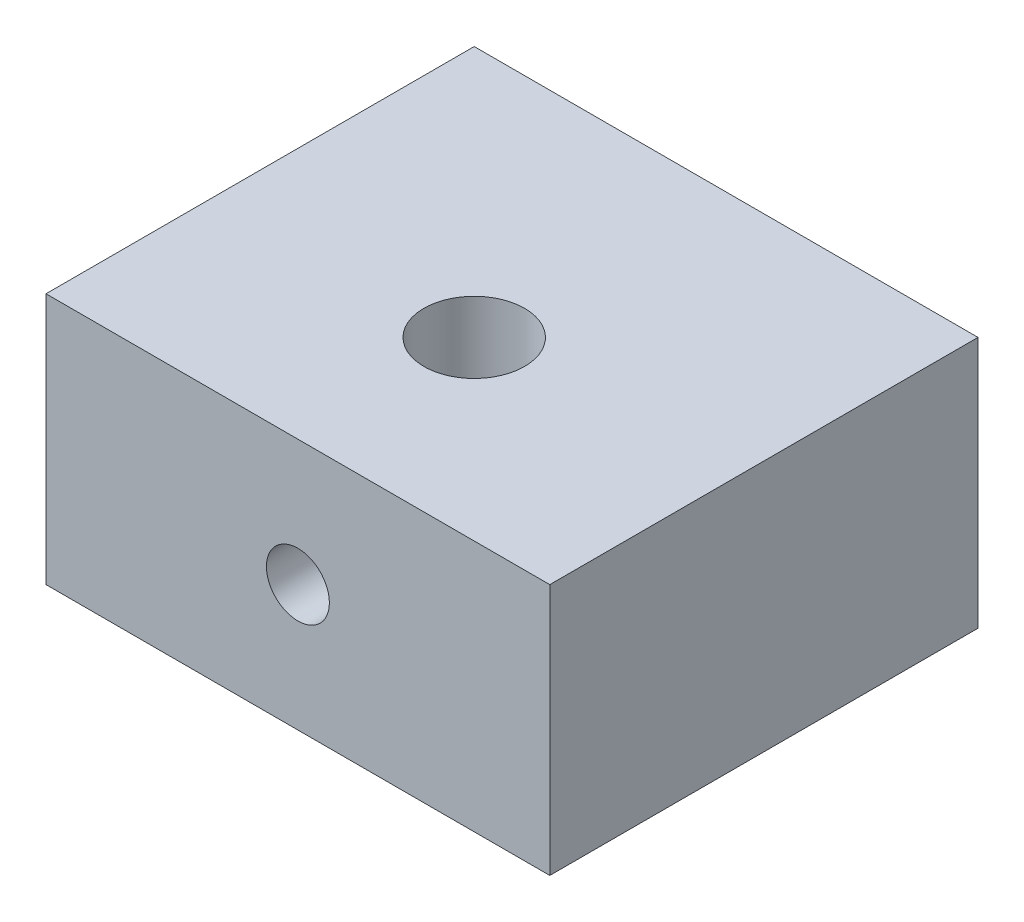
ISO-10303-21;
HEADER;
FILE_DESCRIPTION(('STEP AP214'),'2;1');
FILE_NAME('part.step','',(''),(''),'','','');
FILE_SCHEMA(('AUTOMOTIVE_DESIGN { 1 0 10303 214 1 1 1 1 }'));
ENDSEC;
DATA;
#1=APPLICATION_CONTEXT('core data for automotive mechanical design processes');
#2=APPLICATION_PROTOCOL_DEFINITION('international standard','automotive_design',2000,#1);
#3=PRODUCT_CONTEXT('',#1,'mechanical');
#4=PRODUCT('Part','Part','',(#3));
#5=PRODUCT_RELATED_PRODUCT_CATEGORY('part','',(#4));
#6=PRODUCT_DEFINITION_FORMATION('','',#4);
#7=PRODUCT_DEFINITION_CONTEXT('part definition',#1,'design');
#8=PRODUCT_DEFINITION('design','',#6,#7);
#9=PRODUCT_DEFINITION_SHAPE('','',#8);
#10=(LENGTH_UNIT() NAMED_UNIT(*) SI_UNIT(.MILLI.,.METRE.));
#11=(NAMED_UNIT(*) PLANE_ANGLE_UNIT() SI_UNIT($,.RADIAN.));
#12=(NAMED_UNIT(*) SI_UNIT($,.STERADIAN.) SOLID_ANGLE_UNIT());
#13=UNCERTAINTY_MEASURE_WITH_UNIT(LENGTH_MEASURE(1.E-05),#10,'distance_accuracy_value','');
#14=(GEOMETRIC_REPRESENTATION_CONTEXT(3) GLOBAL_UNCERTAINTY_ASSIGNED_CONTEXT((#13)) GLOBAL_UNIT_ASSIGNED_CONTEXT((#10,
#11,#12)) REPRESENTATION_CONTEXT('',''));
#15=CARTESIAN_POINT('',(0.,0.,0.));
#16=DIRECTION('',(0.,0.,1.));
#17=DIRECTION('',(1.,0.,0.));
#18=AXIS2_PLACEMENT_3D('',#15,#16,#17);
#19=CARTESIAN_POINT('',(0.,0.,17.));
#20=DIRECTION('',(1.,0.,0.));
#21=DIRECTION('',(0.,0.,-1.));
#22=AXIS2_PLACEMENT_3D('',#19,#20,#21);
#23=PLANE('',#22);
#24=DIRECTION('',(0.,-1.,0.));
#25=VECTOR('',#24,1.);
#26=CARTESIAN_POINT('',(0.,0.,0.));
#27=LINE('',#26,#25);
#28=CARTESIAN_POINT('',(0.,10.,0.));
#29=VERTEX_POINT('',#28);
#30=CARTESIAN_POINT('',(0.,0.,0.));
#31=VERTEX_POINT('',#30);
#32=EDGE_CURVE('E126',#29,#31,#27,.T.);
#33=ORIENTED_EDGE('',*,*,#32,.T.);
#34=DIRECTION('',(0.,0.,-1.));
#35=VECTOR('',#34,1.);
#36=CARTESIAN_POINT('',(0.,0.,17.));
#37=LINE('',#36,#35);
#38=CARTESIAN_POINT('',(0.,0.,17.));
#39=VERTEX_POINT('',#38);
#40=EDGE_CURVE('E11',#39,#31,#37,.T.);
#41=ORIENTED_EDGE('',*,*,#40,.F.);
#42=DIRECTION('',(0.,-1.,0.));
#43=VECTOR('',#42,1.);
#44=CARTESIAN_POINT('',(0.,0.,17.));
#45=LINE('',#44,#43);
#46=CARTESIAN_POINT('',(0.,10.,17.));
#47=VERTEX_POINT('',#46);
#48=EDGE_CURVE('E129',#47,#39,#45,.T.);
#49=ORIENTED_EDGE('',*,*,#48,.F.);
#50=DIRECTION('',(0.,0.,-1.));
#51=VECTOR('',#50,1.);
#52=CARTESIAN_POINT('',(0.,10.,17.));
#53=LINE('',#52,#51);
#54=EDGE_CURVE('E135',#47,#29,#53,.T.);
#55=ORIENTED_EDGE('',*,*,#54,.T.);
#56=EDGE_LOOP('',(#33,#41,#49,#55));
#57=FACE_BOUND('',#56,.T.);
#58=ADVANCED_FACE('F45',(#57),#23,.F.);
#59=CARTESIAN_POINT('',(0.,0.,17.));
#60=DIRECTION('',(0.,1.,0.));
#61=DIRECTION('',(0.,0.,1.));
#62=AXIS2_PLACEMENT_3D('',#59,#60,#61);
#63=PLANE('',#62);
#64=CARTESIAN_POINT('',(10.,0.,10.));
#65=DIRECTION('',(0.,-1.,0.));
#66=DIRECTION('',(0.,0.,-1.));
#67=AXIS2_PLACEMENT_3D('',#64,#65,#66);
#68=CIRCLE('',#67,2.);
#69=CARTESIAN_POINT('',(10.,0.,8.));
#70=VERTEX_POINT('',#69);
#71=EDGE_CURVE('E122',#70,#70,#68,.T.);
#72=ORIENTED_EDGE('',*,*,#71,.F.);
#73=EDGE_LOOP('',(#72));
#74=FACE_BOUND('',#73,.T.);
#75=DIRECTION('',(1.,0.,0.));
#76=VECTOR('',#75,1.);
#77=CARTESIAN_POINT('',(0.,0.,0.));
#78=LINE('',#77,#76);
#79=CARTESIAN_POINT('',(20.,0.,0.));
#80=VERTEX_POINT('',#79);
#81=EDGE_CURVE('E138',#31,#80,#78,.T.);
#82=ORIENTED_EDGE('',*,*,#81,.T.);
#83=DIRECTION('',(0.,0.,-1.));
#84=VECTOR('',#83,1.);
#85=CARTESIAN_POINT('',(20.,0.,17.));
#86=LINE('',#85,#84);
#87=CARTESIAN_POINT('',(20.,0.,17.));
#88=VERTEX_POINT('',#87);
#89=EDGE_CURVE('E53',#88,#80,#86,.T.);
#90=ORIENTED_EDGE('',*,*,#89,.F.);
#91=DIRECTION('',(1.,0.,0.));
#92=VECTOR('',#91,1.);
#93=CARTESIAN_POINT('',(0.,0.,17.));
#94=LINE('',#93,#92);
#95=EDGE_CURVE('E92',#39,#88,#94,.T.);
#96=ORIENTED_EDGE('',*,*,#95,.F.);
#97=ORIENTED_EDGE('',*,*,#40,.T.);
#98=EDGE_LOOP('',(#82,#90,#96,#97));
#99=FACE_BOUND('',#98,.T.);
#100=ADVANCED_FACE('F165',(#74,#99),#63,.F.);
#101=CARTESIAN_POINT('',(20.,0.,17.));
#102=DIRECTION('',(-1.,0.,0.));
#103=DIRECTION('',(0.,0.,1.));
#104=AXIS2_PLACEMENT_3D('',#101,#102,#103);
#105=PLANE('',#104);
#106=DIRECTION('',(0.,1.,0.));
#107=VECTOR('',#106,1.);
#108=CARTESIAN_POINT('',(20.,0.,0.));
#109=LINE('',#108,#107);
#110=CARTESIAN_POINT('',(20.,10.,0.));
#111=VERTEX_POINT('',#110);
#112=EDGE_CURVE('E79',#80,#111,#109,.T.);
#113=ORIENTED_EDGE('',*,*,#112,.T.);
#114=DIRECTION('',(0.,0.,-1.));
#115=VECTOR('',#114,1.);
#116=CARTESIAN_POINT('',(20.,10.,17.));
#117=LINE('',#116,#115);
#118=CARTESIAN_POINT('',(20.,10.,17.));
#119=VERTEX_POINT('',#118);
#120=EDGE_CURVE('E143',#119,#111,#117,.T.);
#121=ORIENTED_EDGE('',*,*,#120,.F.);
#122=DIRECTION('',(0.,1.,0.));
#123=VECTOR('',#122,1.);
#124=CARTESIAN_POINT('',(20.,0.,17.));
#125=LINE('',#124,#123);
#126=EDGE_CURVE('E132',#88,#119,#125,.T.);
#127=ORIENTED_EDGE('',*,*,#126,.F.);
#128=ORIENTED_EDGE('',*,*,#89,.T.);
#129=EDGE_LOOP('',(#113,#121,#127,#128));
#130=FACE_BOUND('',#129,.T.);
#131=ADVANCED_FACE('F145',(#130),#105,.F.);
#132=CARTESIAN_POINT('',(0.,10.,17.));
#133=DIRECTION('',(0.,-1.,0.));
#134=DIRECTION('',(0.,0.,-1.));
#135=AXIS2_PLACEMENT_3D('',#132,#133,#134);
#136=PLANE('',#135);
#137=CARTESIAN_POINT('',(10.,10.,10.));
#138=DIRECTION('',(0.,-1.,0.));
#139=DIRECTION('',(0.,0.,-1.));
#140=AXIS2_PLACEMENT_3D('',#137,#138,#139);
#141=CIRCLE('',#140,2.);
#142=CARTESIAN_POINT('',(10.,10.,8.));
#143=VERTEX_POINT('',#142);
#144=EDGE_CURVE('E123',#143,#143,#141,.T.);
#145=ORIENTED_EDGE('',*,*,#144,.T.);
#146=EDGE_LOOP('',(#145));
#147=FACE_BOUND('',#146,.T.);
#148=DIRECTION('',(-1.,0.,0.));
#149=VECTOR('',#148,1.);
#150=CARTESIAN_POINT('',(0.,10.,0.));
#151=LINE('',#150,#149);
#152=EDGE_CURVE('E85',#111,#29,#151,.T.);
#153=ORIENTED_EDGE('',*,*,#152,.T.);
#154=ORIENTED_EDGE('',*,*,#54,.F.);
#155=DIRECTION('',(-1.,0.,0.));
#156=VECTOR('',#155,1.);
#157=CARTESIAN_POINT('',(0.,10.,17.));
#158=LINE('',#157,#156);
#159=EDGE_CURVE('E61',#119,#47,#158,.T.);
#160=ORIENTED_EDGE('',*,*,#159,.F.);
#161=ORIENTED_EDGE('',*,*,#120,.T.);
#162=EDGE_LOOP('',(#153,#154,#160,#161));
#163=FACE_BOUND('',#162,.T.);
#164=ADVANCED_FACE('F152',(#147,#163),#136,.F.);
#165=CARTESIAN_POINT('',(0.,0.,17.));
#166=DIRECTION('',(0.,0.,-1.));
#167=DIRECTION('',(-1.,0.,0.));
#168=AXIS2_PLACEMENT_3D('',#165,#166,#167);
#169=PLANE('',#168);
#170=CARTESIAN_POINT('',(10.,5.,17.));
#171=DIRECTION('',(0.,0.,1.));
#172=DIRECTION('',(1.,0.,0.));
#173=AXIS2_PLACEMENT_3D('',#170,#171,#172);
#174=CIRCLE('',#173,1.24999999999999);
#175=CARTESIAN_POINT('',(11.25,5.,17.));
#176=VERTEX_POINT('',#175);
#177=EDGE_CURVE('E206',#176,#176,#174,.T.);
#178=ORIENTED_EDGE('',*,*,#177,.F.);
#179=EDGE_LOOP('',(#178));
#180=FACE_BOUND('',#179,.T.);
#181=ORIENTED_EDGE('',*,*,#48,.T.);
#182=ORIENTED_EDGE('',*,*,#95,.T.);
#183=ORIENTED_EDGE('',*,*,#126,.T.);
#184=ORIENTED_EDGE('',*,*,#159,.T.);
#185=EDGE_LOOP('',(#181,#182,#183,#184));
#186=FACE_BOUND('',#185,.T.);
#187=ADVANCED_FACE('F154',(#180,#186),#169,.F.);
#188=CARTESIAN_POINT('',(0.,0.,0.));
#189=DIRECTION('',(0.,0.,-1.));
#190=DIRECTION('',(-1.,0.,0.));
#191=AXIS2_PLACEMENT_3D('',#188,#189,#190);
#192=PLANE('',#191);
#193=CARTESIAN_POINT('',(15.,5.,0.));
#194=DIRECTION('',(0.,0.,-1.));
#195=DIRECTION('',(-1.,0.,0.));
#196=AXIS2_PLACEMENT_3D('',#193,#194,#195);
#197=CIRCLE('',#196,1.24999999999999);
#198=CARTESIAN_POINT('',(13.75,5.,0.));
#199=VERTEX_POINT('',#198);
#200=EDGE_CURVE('E110',#199,#199,#197,.T.);
#201=ORIENTED_EDGE('',*,*,#200,.F.);
#202=EDGE_LOOP('',(#201));
#203=FACE_BOUND('',#202,.T.);
#204=CARTESIAN_POINT('',(5.,5.,0.));
#205=DIRECTION('',(0.,0.,-1.));
#206=DIRECTION('',(-1.,0.,0.));
#207=AXIS2_PLACEMENT_3D('',#204,#205,#206);
#208=CIRCLE('',#207,1.24999999999999);
#209=CARTESIAN_POINT('',(3.75000000000001,5.,0.));
#210=VERTEX_POINT('',#209);
#211=EDGE_CURVE('E109',#210,#210,#208,.T.);
#212=ORIENTED_EDGE('',*,*,#211,.F.);
#213=EDGE_LOOP('',(#212));
#214=FACE_BOUND('',#213,.T.);
#215=ORIENTED_EDGE('',*,*,#32,.F.);
#216=ORIENTED_EDGE('',*,*,#152,.F.);
#217=ORIENTED_EDGE('',*,*,#112,.F.);
#218=ORIENTED_EDGE('',*,*,#81,.F.);
#219=EDGE_LOOP('',(#215,#216,#217,#218));
#220=FACE_BOUND('',#219,.T.);
#221=ADVANCED_FACE('F148',(#203,#214,#220),#192,.T.);
#222=CARTESIAN_POINT('',(10.,10.,10.));
#223=DIRECTION('',(0.,-1.,0.));
#224=DIRECTION('',(0.,0.,-1.));
#225=AXIS2_PLACEMENT_3D('',#222,#223,#224);
#226=CYLINDRICAL_SURFACE('',#225,2.);
#227=CARTESIAN_POINT('',(11.25,5.,11.5612494995996));
#228=CARTESIAN_POINT('',(11.2499946221048,5.06212028180293,11.5612580007256));
#229=CARTESIAN_POINT('',(11.2453269384966,5.12433783537026,11.5650264270884));
#230=CARTESIAN_POINT('',(11.2269895083293,5.24667632007938,11.5794371720548));
#231=CARTESIAN_POINT('',(11.2132953043055,5.30679108636524,11.5900981646412));
#232=CARTESIAN_POINT('',(11.1778807391187,5.42278232269884,11.6165008532904));
#233=CARTESIAN_POINT('',(11.1562299333278,5.47869060868181,11.6321983741803));
#234=CARTESIAN_POINT('',(11.1057194556192,5.58600886163815,11.6668295071443));
#235=CARTESIAN_POINT('',(11.0768595870609,5.6374187058565,11.6857632074868));
#236=CARTESIAN_POINT('',(11.0082393792836,5.74186515447698,11.7277961137471));
#237=CARTESIAN_POINT('',(10.9675360936925,5.79419474083259,11.7511133822735));
#238=CARTESIAN_POINT('',(10.8783086644969,5.89188269914496,11.7975282085488));
#239=CARTESIAN_POINT('',(10.8297777812974,5.93723499728392,11.8206255586333));
#240=CARTESIAN_POINT('',(10.7191866652585,6.02510358514812,11.8672945389101));
#241=CARTESIAN_POINT('',(10.6562005689106,6.0666176681043,11.8905872224145));
#242=CARTESIAN_POINT('',(10.5224040708373,6.13812520476315,11.9318323169914));
#243=CARTESIAN_POINT('',(10.4516015064782,6.16813006575125,11.9497900117984));
#244=CARTESIAN_POINT('',(10.311776878362,6.21248231060706,11.976698413182));
#245=CARTESIAN_POINT('',(10.2433056360472,6.22811141639693,11.9863792242204));
#246=CARTESIAN_POINT('',(10.1041051006623,6.2476320696434,11.998505443792));
#247=CARTESIAN_POINT('',(10.033378260564,6.25153595612055,12.0009584584366));
#248=CARTESIAN_POINT('',(9.90193417157866,6.24764431072238,11.9985290910753));
#249=CARTESIAN_POINT('',(9.84114747672621,6.24134862369909,11.994586998119));
#250=CARTESIAN_POINT('',(9.72169335409633,6.22013301563667,11.9814527226123));
#251=CARTESIAN_POINT('',(9.66302608685303,6.20521244276248,11.9722601432512));
#252=CARTESIAN_POINT('',(9.54911088292293,6.16739622490287,11.9493813361468));
#253=CARTESIAN_POINT('',(9.49387212450677,6.1444801759514,11.9356836167391));
#254=CARTESIAN_POINT('',(9.38798077953062,6.09153124474,11.9048563288933));
#255=CARTESIAN_POINT('',(9.33732924144,6.06149674110939,11.8877259787423));
#256=CARTESIAN_POINT('',(9.23528648443296,5.99097183467062,11.8489322475079));
#257=CARTESIAN_POINT('',(9.18458765508105,5.94964537325766,11.8269700430714));
#258=CARTESIAN_POINT('',(9.09040140409451,5.85986761977662,11.7819546275224));
#259=CARTESIAN_POINT('',(9.04692466121037,5.81140597355345,11.7588998644917));
#260=CARTESIAN_POINT('',(8.96264554107069,5.70129437709389,11.710714421122));
#261=CARTESIAN_POINT('',(8.92293384520054,5.63874861914969,11.685705815332));
#262=CARTESIAN_POINT('',(8.85473846796692,5.50635388022657,11.640141390954));
#263=CARTESIAN_POINT('',(8.82623410396642,5.43651865604458,11.6195774019168));
#264=CARTESIAN_POINT('',(8.78781433146834,5.31023059711212,11.5909187656712));
#265=CARTESIAN_POINT('',(8.77498158278279,5.25508903736232,11.5809670430527));
#266=CARTESIAN_POINT('',(8.75689831462477,5.14288481125106,11.5667913887577));
#267=CARTESIAN_POINT('',(8.75163743646726,5.0858248789601,11.5625596323743));
#268=CARTESIAN_POINT('',(8.74901464045493,4.97127131945972,11.5604613353016));
#269=CARTESIAN_POINT('',(8.75167082423424,4.91377699863417,11.5626093814044));
#270=CARTESIAN_POINT('',(8.76474266444013,4.80021941896839,11.5729604286271));
#271=CARTESIAN_POINT('',(8.77516474679739,4.74415738503707,11.5811684440466));
#272=CARTESIAN_POINT('',(8.80295064275171,4.63578161613419,11.6023006060196));
#273=CARTESIAN_POINT('',(8.82019719373213,4.58342132666848,11.6151447793717));
#274=CARTESIAN_POINT('',(8.86097548061478,4.48221266544302,11.6441557344084));
#275=CARTESIAN_POINT('',(8.8845094472858,4.4333655479755,11.6603236948991));
#276=CARTESIAN_POINT('',(8.94234623227682,4.33069396082297,11.6978720398894));
#277=CARTESIAN_POINT('',(8.9778462618578,4.27769245875067,11.7196587573829));
#278=CARTESIAN_POINT('',(9.05630973677515,4.17781494756085,11.7639395800071));
#279=CARTESIAN_POINT('',(9.09928092550341,4.13094538302204,11.7864343990335));
#280=CARTESIAN_POINT('',(9.19961934050082,4.03701675375684,11.8338316401897));
#281=CARTESIAN_POINT('',(9.25819005028585,3.99113144299232,11.858542047876));
#282=CARTESIAN_POINT('',(9.38370001213044,3.90993134812415,11.90384248965));
#283=CARTESIAN_POINT('',(9.45063532125135,3.87461161002636,11.9244344532913));
#284=CARTESIAN_POINT('',(9.58707409936341,3.81800500879736,11.9580925595756));
#285=CARTESIAN_POINT('',(9.65618517745549,3.79600579352924,11.9715348458918));
#286=CARTESIAN_POINT('',(9.79813900111527,3.76427333131892,11.9910701008804));
#287=CARTESIAN_POINT('',(9.87097643676164,3.75452311023889,11.99717323933));
#288=CARTESIAN_POINT('',(10.0065990719968,3.74845347996122,12.0009668574856));
#289=CARTESIAN_POINT('',(10.0692812975955,3.75036422321302,11.9997660062362));
#290=CARTESIAN_POINT('',(10.1932798110917,3.76346167497434,11.9916073995877));
#291=CARTESIAN_POINT('',(10.2545961608407,3.77464796257578,11.9846499054152));
#292=CARTESIAN_POINT('',(10.3720432946855,3.8051604748766,11.9659610468898));
#293=CARTESIAN_POINT('',(10.4282801806783,3.82419083987321,11.954403674717));
#294=CARTESIAN_POINT('',(10.5367143691113,3.86955992816408,11.9274496867726));
#295=CARTESIAN_POINT('',(10.5889109881182,3.8958998844756,11.9120524233141));
#296=CARTESIAN_POINT('',(10.6936567374707,3.95816057899121,11.8767534223982));
#297=CARTESIAN_POINT('',(10.7456801271622,3.99479198131899,11.8565500246696));
#298=CARTESIAN_POINT('',(10.8432166083554,4.07507663033271,11.8143364045624));
#299=CARTESIAN_POINT('',(10.8887222430552,4.11873780024596,11.7923241573062));
#300=CARTESIAN_POINT('',(10.9787236013008,4.21911626230329,11.7450041509952));
#301=CARTESIAN_POINT('',(11.0221282987382,4.27680834517693,11.7196787144631));
#302=CARTESIAN_POINT('',(11.0987732500574,4.39964466601013,11.6717482149704));
#303=CARTESIAN_POINT('',(11.132019125571,4.46478475490761,11.6491416516705));
#304=CARTESIAN_POINT('',(11.1809911092323,4.58640276792968,11.6142977608021));
#305=CARTESIAN_POINT('',(11.1989621627638,4.64163568087938,11.6008734034965));
#306=CARTESIAN_POINT('',(11.2271282218041,4.75496927795721,11.5793915843794));
#307=CARTESIAN_POINT('',(11.237347842454,4.81306025502416,11.5713171440018));
#308=CARTESIAN_POINT('',(11.245599061831,4.89303052386286,11.5647645638939));
#309=CARTESIAN_POINT('',(11.2472467125958,4.914364145517,11.5634506954683));
#310=CARTESIAN_POINT('',(11.2494482473429,4.95712796652149,11.5616915869505));
#311=CARTESIAN_POINT('',(11.2500018562667,4.97855818880169,11.5612465652997));
#312=CARTESIAN_POINT('',(11.25,5.,11.5612494995996));
#313=B_SPLINE_CURVE_WITH_KNOTS('',3,(#227,#228,#229,#230,#231,#232,#233,#234,#235,#236,#237,
#238,#239,#240,#241,#242,#243,#244,#245,#246,#247,#248,#249,#250,#251,#252,#253,#254,#255,#256,
#257,#258,#259,#260,#261,#262,#263,#264,#265,#266,#267,#268,#269,#270,#271,#272,#273,#274,#275,
#276,#277,#278,#279,#280,#281,#282,#283,#284,#285,#286,#287,#288,#289,#290,#291,#292,#293,#294,
#295,#296,#297,#298,#299,#300,#301,#302,#303,#304,#305,#306,#307,#308,#309,#310,#311,#312),
.UNSPECIFIED.,.T.,.F.,(4,2,2,2,2,2,2,2,2,2,2,2,2,2,2,2,2,2,2,2,2,2,2,2,2,2,2,2,2,2,2,2,2,2,2,2,
2,2,2,2,2,2,4),(0.,0.186262444012014,0.373031654397094,0.558205556130399,0.743384509377747,
0.95340620744007,1.16360970997911,1.39917236034456,1.6345009273926,1.84590412815397,
2.05708478092386,2.2399231958351,2.42277543076413,2.60609774825955,2.7894618612817,
2.99564504832106,3.20213044016184,3.43558067920819,3.66859805095276,3.84032775480266,
4.01182230007288,4.18370925240737,4.35573859160079,4.52493212343596,4.69418576487133,
4.89566333610126,5.09735098485252,5.33136598660887,5.56527109061623,5.78520080494546,
6.00482541258958,6.19203601525121,6.3792381230858,6.55994569114421,6.74068376037877,
6.94018144108742,7.13990556958865,7.36841817421245,7.59680409585383,7.77496902270409,
7.95256577963381,8.01684109069494,8.08113255947018),.UNSPECIFIED.);
#314=CARTESIAN_POINT('',(11.25,5.,11.5612494995996));
#315=VERTEX_POINT('',#314);
#316=EDGE_CURVE('E116',#315,#315,#313,.T.);
#317=ORIENTED_EDGE('',*,*,#316,.T.);
#318=EDGE_LOOP('',(#317));
#319=FACE_BOUND('',#318,.T.);
#320=ORIENTED_EDGE('',*,*,#144,.F.);
#321=EDGE_LOOP('',(#320));
#322=FACE_BOUND('',#321,.T.);
#323=ORIENTED_EDGE('',*,*,#71,.T.);
#324=EDGE_LOOP('',(#323));
#325=FACE_BOUND('',#324,.T.);
#326=ADVANCED_FACE('F176',(#319,#322,#325),#226,.F.);
#327=CARTESIAN_POINT('',(5.,5.,12.5));
#328=DIRECTION('',(0.,0.,-1.));
#329=DIRECTION('',(-1.,0.,0.));
#330=AXIS2_PLACEMENT_3D('',#327,#328,#329);
#331=CONICAL_SURFACE('',#330,1.25,1.02974425867665);
#332=CARTESIAN_POINT('',(5.,5.,13.2510757737845));
#333=VERTEX_POINT('',#332);
#334=VERTEX_LOOP('',#333);
#335=FACE_BOUND('',#334,.T.);
#336=CARTESIAN_POINT('',(5.,5.,12.5));
#337=DIRECTION('',(0.,0.,-1.));
#338=DIRECTION('',(-1.,0.,0.));
#339=AXIS2_PLACEMENT_3D('',#336,#337,#338);
#340=CIRCLE('',#339,1.25);
#341=CARTESIAN_POINT('',(3.75,5.,12.5));
#342=VERTEX_POINT('',#341);
#343=EDGE_CURVE('E113',#342,#342,#340,.T.);
#344=ORIENTED_EDGE('',*,*,#343,.T.);
#345=EDGE_LOOP('',(#344));
#346=FACE_BOUND('',#345,.T.);
#347=ADVANCED_FACE('F178',(#335,#346),#331,.F.);
#348=CARTESIAN_POINT('',(5.,5.,0.));
#349=DIRECTION('',(0.,0.,-1.));
#350=DIRECTION('',(-1.,0.,0.));
#351=AXIS2_PLACEMENT_3D('',#348,#349,#350);
#352=CYLINDRICAL_SURFACE('',#351,1.24999999999999);
#353=ORIENTED_EDGE('',*,*,#343,.F.);
#354=EDGE_LOOP('',(#353));
#355=FACE_BOUND('',#354,.T.);
#356=ORIENTED_EDGE('',*,*,#211,.T.);
#357=EDGE_LOOP('',(#356));
#358=FACE_BOUND('',#357,.T.);
#359=ADVANCED_FACE('F103',(#355,#358),#352,.F.);
#360=CARTESIAN_POINT('',(15.,5.,12.5));
#361=DIRECTION('',(0.,0.,-1.));
#362=DIRECTION('',(-1.,0.,0.));
#363=AXIS2_PLACEMENT_3D('',#360,#361,#362);
#364=CONICAL_SURFACE('',#363,1.25,1.02974425867665);
#365=CARTESIAN_POINT('',(15.,5.,13.2510757737845));
#366=VERTEX_POINT('',#365);
#367=VERTEX_LOOP('',#366);
#368=FACE_BOUND('',#367,.T.);
#369=CARTESIAN_POINT('',(15.,5.,12.5));
#370=DIRECTION('',(0.,0.,-1.));
#371=DIRECTION('',(-1.,0.,0.));
#372=AXIS2_PLACEMENT_3D('',#369,#370,#371);
#373=CIRCLE('',#372,1.25);
#374=CARTESIAN_POINT('',(13.75,5.,12.5));
#375=VERTEX_POINT('',#374);
#376=EDGE_CURVE('E107',#375,#375,#373,.T.);
#377=ORIENTED_EDGE('',*,*,#376,.T.);
#378=EDGE_LOOP('',(#377));
#379=FACE_BOUND('',#378,.T.);
#380=ADVANCED_FACE('F99',(#368,#379),#364,.F.);
#381=CARTESIAN_POINT('',(15.,5.,0.));
#382=DIRECTION('',(0.,0.,-1.));
#383=DIRECTION('',(-1.,0.,0.));
#384=AXIS2_PLACEMENT_3D('',#381,#382,#383);
#385=CYLINDRICAL_SURFACE('',#384,1.24999999999999);
#386=ORIENTED_EDGE('',*,*,#376,.F.);
#387=EDGE_LOOP('',(#386));
#388=FACE_BOUND('',#387,.T.);
#389=ORIENTED_EDGE('',*,*,#200,.T.);
#390=EDGE_LOOP('',(#389));
#391=FACE_BOUND('',#390,.T.);
#392=ADVANCED_FACE('F102',(#388,#391),#385,.F.);
#393=CARTESIAN_POINT('',(10.,5.,17.));
#394=DIRECTION('',(0.,0.,1.));
#395=DIRECTION('',(1.,0.,0.));
#396=AXIS2_PLACEMENT_3D('',#393,#394,#395);
#397=CYLINDRICAL_SURFACE('',#396,1.24999999999999);
#398=ORIENTED_EDGE('',*,*,#316,.F.);
#399=EDGE_LOOP('',(#398));
#400=FACE_BOUND('',#399,.T.);
#401=ORIENTED_EDGE('',*,*,#177,.T.);
#402=EDGE_LOOP('',(#401));
#403=FACE_BOUND('',#402,.T.);
#404=ADVANCED_FACE('F198',(#400,#403),#397,.F.);
#405=CLOSED_SHELL('',(#58,#100,#131,#164,#187,#221,#326,#347,#359,#380,#392,#404));
#406=MANIFOLD_SOLID_BREP('B2',#405);
#407=ADVANCED_BREP_SHAPE_REPRESENTATION('',(#18,#406),#14);
#408=SHAPE_DEFINITION_REPRESENTATION(#9,#407);
ENDSEC;
END-ISO-10303-21;
